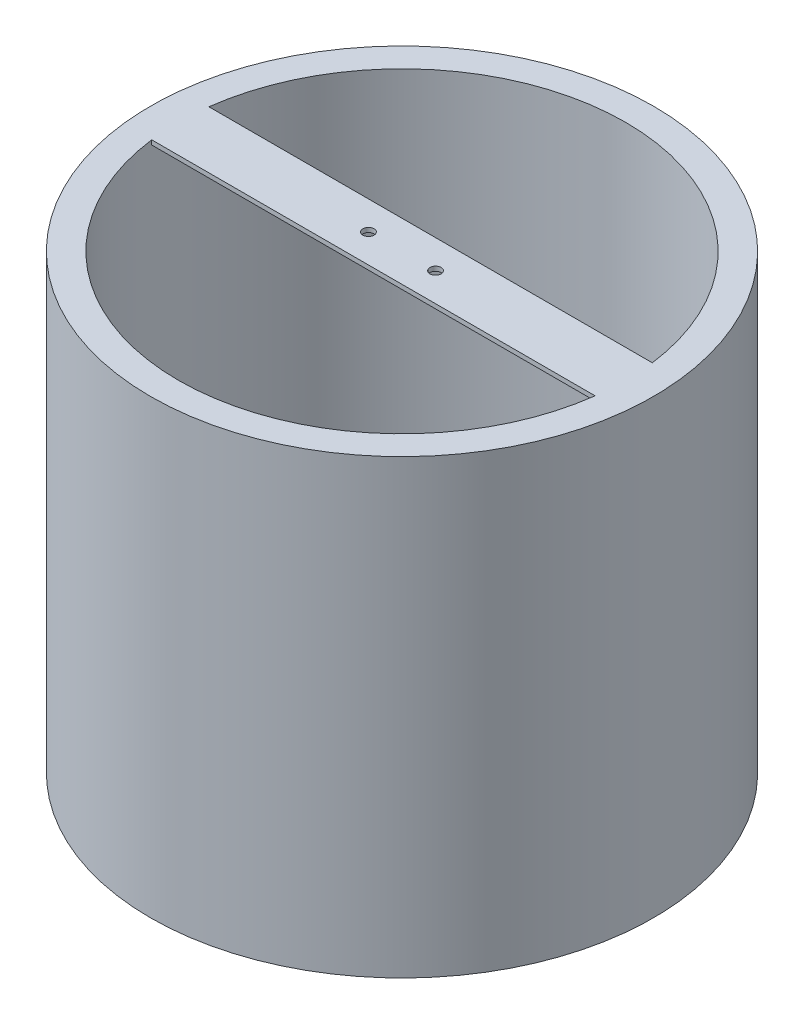
ISO-10303-21;
HEADER;
FILE_DESCRIPTION(('STEP AP214'),'2;1');
FILE_NAME('part.step','',(''),(''),'','','');
FILE_SCHEMA(('AUTOMOTIVE_DESIGN { 1 0 10303 214 1 1 1 1 }'));
ENDSEC;
DATA;
#1=APPLICATION_CONTEXT('core data for automotive mechanical design processes');
#2=APPLICATION_PROTOCOL_DEFINITION('international standard','automotive_design',2000,#1);
#3=PRODUCT_CONTEXT('',#1,'mechanical');
#4=PRODUCT('Part','Part','',(#3));
#5=PRODUCT_RELATED_PRODUCT_CATEGORY('part','',(#4));
#6=PRODUCT_DEFINITION_FORMATION('','',#4);
#7=PRODUCT_DEFINITION_CONTEXT('part definition',#1,'design');
#8=PRODUCT_DEFINITION('design','',#6,#7);
#9=PRODUCT_DEFINITION_SHAPE('','',#8);
#10=(LENGTH_UNIT() NAMED_UNIT(*) SI_UNIT(.MILLI.,.METRE.));
#11=(NAMED_UNIT(*) PLANE_ANGLE_UNIT() SI_UNIT($,.RADIAN.));
#12=(NAMED_UNIT(*) SI_UNIT($,.STERADIAN.) SOLID_ANGLE_UNIT());
#13=UNCERTAINTY_MEASURE_WITH_UNIT(LENGTH_MEASURE(1.E-05),#10,'distance_accuracy_value','');
#14=(GEOMETRIC_REPRESENTATION_CONTEXT(3) GLOBAL_UNCERTAINTY_ASSIGNED_CONTEXT((#13)) GLOBAL_UNIT_ASSIGNED_CONTEXT((#10,
#11,#12)) REPRESENTATION_CONTEXT('',''));
#15=CARTESIAN_POINT('',(0.,0.,0.));
#16=DIRECTION('',(0.,0.,1.));
#17=DIRECTION('',(1.,0.,0.));
#18=AXIS2_PLACEMENT_3D('',#15,#16,#17);
#19=CARTESIAN_POINT('',(0.,0.,0.));
#20=DIRECTION('',(0.,1.,0.));
#21=DIRECTION('',(0.,0.,1.));
#22=AXIS2_PLACEMENT_3D('',#19,#20,#21);
#23=PLANE('',#22);
#24=CARTESIAN_POINT('',(0.,0.,0.));
#25=DIRECTION('',(0.,1.,0.));
#26=DIRECTION('',(0.,0.,1.));
#27=AXIS2_PLACEMENT_3D('',#24,#25,#26);
#28=CIRCLE('',#27,57.15);
#29=CARTESIAN_POINT('',(0.,0.,57.15));
#30=VERTEX_POINT('',#29);
#31=EDGE_CURVE('E12',#30,#30,#28,.T.);
#32=ORIENTED_EDGE('',*,*,#31,.F.);
#33=EDGE_LOOP('',(#32));
#34=FACE_BOUND('',#33,.T.);
#35=CARTESIAN_POINT('',(0.,0.,0.));
#36=DIRECTION('',(0.,1.,0.));
#37=DIRECTION('',(0.,0.,1.));
#38=AXIS2_PLACEMENT_3D('',#35,#36,#37);
#39=CIRCLE('',#38,50.8);
#40=CARTESIAN_POINT('',(0.,0.,50.8));
#41=VERTEX_POINT('',#40);
#42=EDGE_CURVE('E124',#41,#41,#39,.T.);
#43=ORIENTED_EDGE('',*,*,#42,.T.);
#44=EDGE_LOOP('',(#43));
#45=FACE_BOUND('',#44,.T.);
#46=ADVANCED_FACE('F44',(#34,#45),#23,.F.);
#47=CARTESIAN_POINT('',(0.,101.6,0.));
#48=DIRECTION('',(0.,-1.,0.));
#49=DIRECTION('',(0.,0.,-1.));
#50=AXIS2_PLACEMENT_3D('',#47,#48,#49);
#51=CYLINDRICAL_SURFACE('',#50,57.15);
#52=ORIENTED_EDGE('',*,*,#31,.T.);
#53=EDGE_LOOP('',(#52));
#54=FACE_BOUND('',#53,.T.);
#55=CARTESIAN_POINT('',(0.,102.616,0.));
#56=DIRECTION('',(0.,1.,0.));
#57=DIRECTION('',(0.,0.,1.));
#58=AXIS2_PLACEMENT_3D('',#55,#56,#57);
#59=CIRCLE('',#58,57.15);
#60=CARTESIAN_POINT('',(0.,102.616,57.15));
#61=VERTEX_POINT('',#60);
#62=EDGE_CURVE('E107',#61,#61,#59,.T.);
#63=ORIENTED_EDGE('',*,*,#62,.F.);
#64=EDGE_LOOP('',(#63));
#65=FACE_BOUND('',#64,.T.);
#66=ADVANCED_FACE('F46',(#54,#65),#51,.T.);
#67=CARTESIAN_POINT('',(0.,101.6,0.));
#68=DIRECTION('',(0.,-1.,0.));
#69=DIRECTION('',(0.,0.,-1.));
#70=AXIS2_PLACEMENT_3D('',#67,#68,#69);
#71=CYLINDRICAL_SURFACE('',#70,50.8);
#72=CARTESIAN_POINT('',(0.,101.6,0.));
#73=DIRECTION('',(0.,1.,0.));
#74=DIRECTION('',(0.,0.,1.));
#75=AXIS2_PLACEMENT_3D('',#72,#73,#74);
#76=CIRCLE('',#75,50.8);
#77=CARTESIAN_POINT('',(50.3825201420137,101.6,6.4993587483371));
#78=VERTEX_POINT('',#77);
#79=CARTESIAN_POINT('',(50.3825201420137,101.6,-6.49935874833711));
#80=VERTEX_POINT('',#79);
#81=EDGE_CURVE('E53',#78,#80,#76,.T.);
#82=ORIENTED_EDGE('',*,*,#81,.T.);
#83=DIRECTION('',(0.,-1.,0.));
#84=VECTOR('',#83,1.);
#85=CARTESIAN_POINT('',(50.3825201420137,102.616,-6.49935874833711));
#86=LINE('',#85,#84);
#87=CARTESIAN_POINT('',(50.3825201420137,102.616,-6.49935874833711));
#88=VERTEX_POINT('',#87);
#89=EDGE_CURVE('E123',#88,#80,#86,.T.);
#90=ORIENTED_EDGE('',*,*,#89,.F.);
#91=CARTESIAN_POINT('',(0.,102.616,0.));
#92=DIRECTION('',(0.,1.,0.));
#93=DIRECTION('',(0.,0.,1.));
#94=AXIS2_PLACEMENT_3D('',#91,#92,#93);
#95=CIRCLE('',#94,50.8);
#96=CARTESIAN_POINT('',(-50.3825201420137,102.616,-6.49935874833711));
#97=VERTEX_POINT('',#96);
#98=EDGE_CURVE('E101',#97,#88,#95,.F.);
#99=ORIENTED_EDGE('',*,*,#98,.F.);
#100=DIRECTION('',(0.,-1.,0.));
#101=VECTOR('',#100,1.);
#102=CARTESIAN_POINT('',(-50.3825201420137,102.616,-6.49935874833711));
#103=LINE('',#102,#101);
#104=CARTESIAN_POINT('',(-50.3825201420137,101.6,-6.49935874833711));
#105=VERTEX_POINT('',#104);
#106=EDGE_CURVE('E70',#97,#105,#103,.T.);
#107=ORIENTED_EDGE('',*,*,#106,.T.);
#108=CARTESIAN_POINT('',(-50.3825201420137,101.6,6.49935874833711));
#109=VERTEX_POINT('',#108);
#110=EDGE_CURVE('E87',#105,#109,#76,.T.);
#111=ORIENTED_EDGE('',*,*,#110,.T.);
#112=DIRECTION('',(0.,-1.,0.));
#113=VECTOR('',#112,1.);
#114=CARTESIAN_POINT('',(-50.3825201420137,102.616,6.49935874833711));
#115=LINE('',#114,#113);
#116=CARTESIAN_POINT('',(-50.3825201420137,102.616,6.49935874833711));
#117=VERTEX_POINT('',#116);
#118=EDGE_CURVE('E103',#117,#109,#115,.T.);
#119=ORIENTED_EDGE('',*,*,#118,.F.);
#120=CARTESIAN_POINT('',(50.3825201420137,102.616,6.49935874833711));
#121=VERTEX_POINT('',#120);
#122=EDGE_CURVE('E95',#121,#117,#95,.F.);
#123=ORIENTED_EDGE('',*,*,#122,.F.);
#124=DIRECTION('',(0.,-1.,0.));
#125=VECTOR('',#124,1.);
#126=CARTESIAN_POINT('',(50.3825201420137,102.616,6.49935874833711));
#127=LINE('',#126,#125);
#128=EDGE_CURVE('E90',#121,#78,#127,.T.);
#129=ORIENTED_EDGE('',*,*,#128,.T.);
#130=EDGE_LOOP('',(#82,#90,#99,#107,#111,#119,#123,#129));
#131=FACE_BOUND('',#130,.T.);
#132=ORIENTED_EDGE('',*,*,#42,.F.);
#133=EDGE_LOOP('',(#132));
#134=FACE_BOUND('',#133,.T.);
#135=ADVANCED_FACE('F105',(#131,#134),#71,.F.);
#136=CARTESIAN_POINT('',(0.,102.616,6.4993587483371));
#137=DIRECTION('',(0.,0.,1.));
#138=DIRECTION('',(1.,0.,0.));
#139=AXIS2_PLACEMENT_3D('',#136,#137,#138);
#140=PLANE('',#139);
#141=DIRECTION('',(-1.,0.,0.));
#142=VECTOR('',#141,1.);
#143=CARTESIAN_POINT('',(0.,101.6,6.4993587483371));
#144=LINE('',#143,#142);
#145=EDGE_CURVE('E61',#78,#109,#144,.T.);
#146=ORIENTED_EDGE('',*,*,#145,.F.);
#147=ORIENTED_EDGE('',*,*,#128,.F.);
#148=DIRECTION('',(-1.,0.,0.));
#149=VECTOR('',#148,1.);
#150=CARTESIAN_POINT('',(0.,102.616,6.4993587483371));
#151=LINE('',#150,#149);
#152=EDGE_CURVE('E99',#121,#117,#151,.T.);
#153=ORIENTED_EDGE('',*,*,#152,.T.);
#154=ORIENTED_EDGE('',*,*,#118,.T.);
#155=EDGE_LOOP('',(#146,#147,#153,#154));
#156=FACE_BOUND('',#155,.T.);
#157=ADVANCED_FACE('F109',(#156),#140,.T.);
#158=CARTESIAN_POINT('',(0.,102.616,-6.49935874833711));
#159=DIRECTION('',(0.,0.,-1.));
#160=DIRECTION('',(-1.,0.,0.));
#161=AXIS2_PLACEMENT_3D('',#158,#159,#160);
#162=PLANE('',#161);
#163=DIRECTION('',(1.,0.,0.));
#164=VECTOR('',#163,1.);
#165=CARTESIAN_POINT('',(0.,101.6,-6.49935874833711));
#166=LINE('',#165,#164);
#167=EDGE_CURVE('E110',#105,#80,#166,.T.);
#168=ORIENTED_EDGE('',*,*,#167,.F.);
#169=ORIENTED_EDGE('',*,*,#106,.F.);
#170=DIRECTION('',(1.,0.,0.));
#171=VECTOR('',#170,1.);
#172=CARTESIAN_POINT('',(0.,102.616,-6.49935874833711));
#173=LINE('',#172,#171);
#174=EDGE_CURVE('E117',#97,#88,#173,.T.);
#175=ORIENTED_EDGE('',*,*,#174,.T.);
#176=ORIENTED_EDGE('',*,*,#89,.T.);
#177=EDGE_LOOP('',(#168,#169,#175,#176));
#178=FACE_BOUND('',#177,.T.);
#179=ADVANCED_FACE('F146',(#178),#162,.T.);
#180=CARTESIAN_POINT('',(0.,102.616,0.));
#181=DIRECTION('',(0.,1.,0.));
#182=DIRECTION('',(0.,0.,1.));
#183=AXIS2_PLACEMENT_3D('',#180,#181,#182);
#184=PLANE('',#183);
#185=CARTESIAN_POINT('',(-7.62,102.616,0.));
#186=DIRECTION('',(0.,1.,0.));
#187=DIRECTION('',(0.,0.,1.));
#188=AXIS2_PLACEMENT_3D('',#185,#186,#187);
#189=CIRCLE('',#188,1.27);
#190=CARTESIAN_POINT('',(-7.62,102.616,1.27));
#191=VERTEX_POINT('',#190);
#192=EDGE_CURVE('E131',#191,#191,#189,.T.);
#193=ORIENTED_EDGE('',*,*,#192,.F.);
#194=EDGE_LOOP('',(#193));
#195=FACE_BOUND('',#194,.T.);
#196=CARTESIAN_POINT('',(7.62,102.616,0.));
#197=DIRECTION('',(0.,1.,0.));
#198=DIRECTION('',(0.,0.,1.));
#199=AXIS2_PLACEMENT_3D('',#196,#197,#198);
#200=CIRCLE('',#199,1.27);
#201=CARTESIAN_POINT('',(7.62,102.616,1.27));
#202=VERTEX_POINT('',#201);
#203=EDGE_CURVE('E114',#202,#202,#200,.T.);
#204=ORIENTED_EDGE('',*,*,#203,.F.);
#205=EDGE_LOOP('',(#204));
#206=FACE_BOUND('',#205,.T.);
#207=ORIENTED_EDGE('',*,*,#152,.F.);
#208=ORIENTED_EDGE('',*,*,#122,.T.);
#209=EDGE_LOOP('',(#207,#208));
#210=FACE_BOUND('',#209,.T.);
#211=ORIENTED_EDGE('',*,*,#98,.T.);
#212=ORIENTED_EDGE('',*,*,#174,.F.);
#213=EDGE_LOOP('',(#211,#212));
#214=FACE_BOUND('',#213,.T.);
#215=ORIENTED_EDGE('',*,*,#62,.T.);
#216=EDGE_LOOP('',(#215));
#217=FACE_BOUND('',#216,.T.);
#218=ADVANCED_FACE('F97',(#195,#206,#210,#214,#217),#184,.T.);
#219=CARTESIAN_POINT('',(0.,101.6,0.));
#220=DIRECTION('',(0.,1.,0.));
#221=DIRECTION('',(0.,0.,1.));
#222=AXIS2_PLACEMENT_3D('',#219,#220,#221);
#223=PLANE('',#222);
#224=CARTESIAN_POINT('',(-7.62,101.6,0.));
#225=DIRECTION('',(0.,1.,0.));
#226=DIRECTION('',(0.,0.,1.));
#227=AXIS2_PLACEMENT_3D('',#224,#225,#226);
#228=CIRCLE('',#227,1.27);
#229=CARTESIAN_POINT('',(-7.62,101.6,1.27));
#230=VERTEX_POINT('',#229);
#231=EDGE_CURVE('E48',#230,#230,#228,.T.);
#232=ORIENTED_EDGE('',*,*,#231,.T.);
#233=EDGE_LOOP('',(#232));
#234=FACE_BOUND('',#233,.T.);
#235=CARTESIAN_POINT('',(7.62,101.6,0.));
#236=DIRECTION('',(0.,1.,0.));
#237=DIRECTION('',(0.,0.,1.));
#238=AXIS2_PLACEMENT_3D('',#235,#236,#237);
#239=CIRCLE('',#238,1.27);
#240=CARTESIAN_POINT('',(7.62,101.6,1.27));
#241=VERTEX_POINT('',#240);
#242=EDGE_CURVE('E129',#241,#241,#239,.T.);
#243=ORIENTED_EDGE('',*,*,#242,.T.);
#244=EDGE_LOOP('',(#243));
#245=FACE_BOUND('',#244,.T.);
#246=ORIENTED_EDGE('',*,*,#81,.F.);
#247=ORIENTED_EDGE('',*,*,#145,.T.);
#248=ORIENTED_EDGE('',*,*,#110,.F.);
#249=ORIENTED_EDGE('',*,*,#167,.T.);
#250=EDGE_LOOP('',(#246,#247,#248,#249));
#251=FACE_BOUND('',#250,.T.);
#252=ADVANCED_FACE('F145',(#234,#245,#251),#223,.F.);
#253=CARTESIAN_POINT('',(7.62,87.884,0.));
#254=DIRECTION('',(0.,1.,0.));
#255=DIRECTION('',(0.,0.,1.));
#256=AXIS2_PLACEMENT_3D('',#253,#254,#255);
#257=CYLINDRICAL_SURFACE('',#256,1.27);
#258=ORIENTED_EDGE('',*,*,#203,.T.);
#259=EDGE_LOOP('',(#258));
#260=FACE_BOUND('',#259,.T.);
#261=ORIENTED_EDGE('',*,*,#242,.F.);
#262=EDGE_LOOP('',(#261));
#263=FACE_BOUND('',#262,.T.);
#264=ADVANCED_FACE('F141',(#260,#263),#257,.F.);
#265=CARTESIAN_POINT('',(-7.62,87.884,0.));
#266=DIRECTION('',(0.,1.,0.));
#267=DIRECTION('',(0.,0.,1.));
#268=AXIS2_PLACEMENT_3D('',#265,#266,#267);
#269=CYLINDRICAL_SURFACE('',#268,1.27);
#270=ORIENTED_EDGE('',*,*,#192,.T.);
#271=EDGE_LOOP('',(#270));
#272=FACE_BOUND('',#271,.T.);
#273=ORIENTED_EDGE('',*,*,#231,.F.);
#274=EDGE_LOOP('',(#273));
#275=FACE_BOUND('',#274,.T.);
#276=ADVANCED_FACE('F198',(#272,#275),#269,.F.);
#277=CLOSED_SHELL('',(#46,#66,#135,#157,#179,#218,#252,#264,#276));
#278=MANIFOLD_SOLID_BREP('B2',#277);
#279=ADVANCED_BREP_SHAPE_REPRESENTATION('',(#18,#278),#14);
#280=SHAPE_DEFINITION_REPRESENTATION(#9,#279);
ENDSEC;
END-ISO-10303-21;
